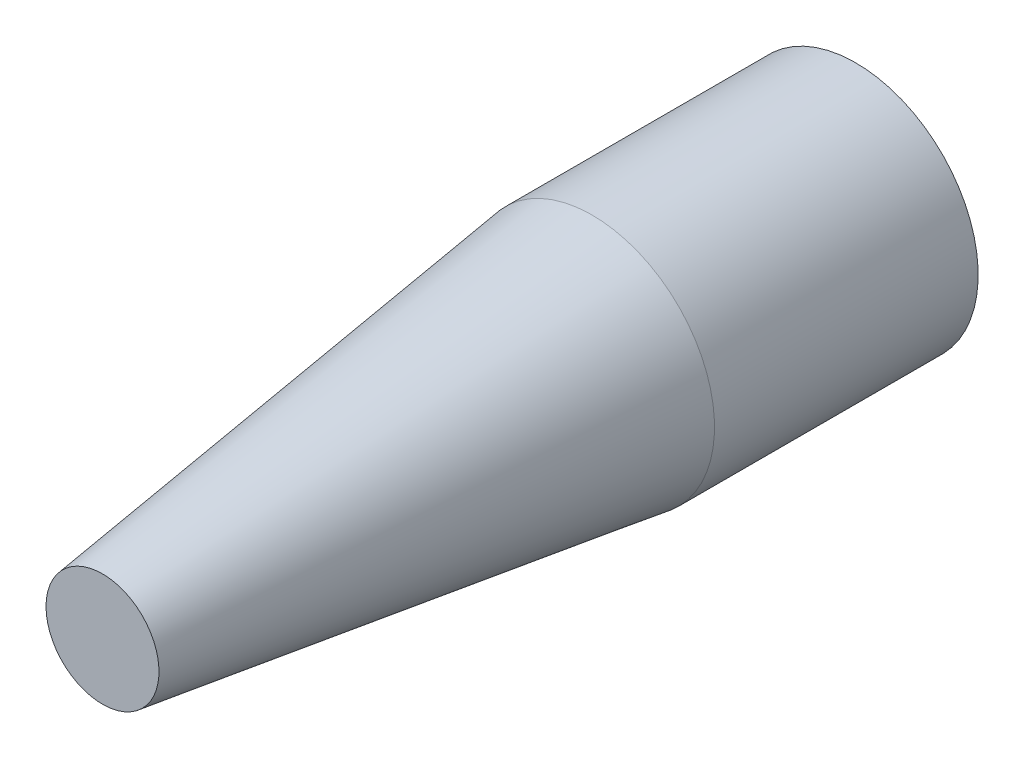
ISO-10303-21;
HEADER;
FILE_DESCRIPTION(('STEP AP214'),'2;1');
FILE_NAME('part.step','',(''),(''),'','','');
FILE_SCHEMA(('AUTOMOTIVE_DESIGN { 1 0 10303 214 1 1 1 1 }'));
ENDSEC;
DATA;
#1=APPLICATION_CONTEXT('core data for automotive mechanical design processes');
#2=APPLICATION_PROTOCOL_DEFINITION('international standard','automotive_design',2000,#1);
#3=PRODUCT_CONTEXT('',#1,'mechanical');
#4=PRODUCT('Part','Part','',(#3));
#5=PRODUCT_RELATED_PRODUCT_CATEGORY('part','',(#4));
#6=PRODUCT_DEFINITION_FORMATION('','',#4);
#7=PRODUCT_DEFINITION_CONTEXT('part definition',#1,'design');
#8=PRODUCT_DEFINITION('design','',#6,#7);
#9=PRODUCT_DEFINITION_SHAPE('','',#8);
#10=(LENGTH_UNIT() NAMED_UNIT(*) SI_UNIT(.MILLI.,.METRE.));
#11=(NAMED_UNIT(*) PLANE_ANGLE_UNIT() SI_UNIT($,.RADIAN.));
#12=(NAMED_UNIT(*) SI_UNIT($,.STERADIAN.) SOLID_ANGLE_UNIT());
#13=UNCERTAINTY_MEASURE_WITH_UNIT(LENGTH_MEASURE(1.E-05),#10,'distance_accuracy_value','');
#14=(GEOMETRIC_REPRESENTATION_CONTEXT(3) GLOBAL_UNCERTAINTY_ASSIGNED_CONTEXT((#13)) GLOBAL_UNIT_ASSIGNED_CONTEXT((#10,
#11,#12)) REPRESENTATION_CONTEXT('',''));
#15=CARTESIAN_POINT('',(0.,0.,0.));
#16=DIRECTION('',(0.,0.,1.));
#17=DIRECTION('',(1.,0.,0.));
#18=AXIS2_PLACEMENT_3D('',#15,#16,#17);
#19=CARTESIAN_POINT('',(0.,0.,7.));
#20=DIRECTION('',(0.,0.,-1.));
#21=DIRECTION('',(-1.,0.,0.));
#22=AXIS2_PLACEMENT_3D('',#19,#20,#21);
#23=CONICAL_SURFACE('',#22,3.25,0.133810977474591);
#24=CARTESIAN_POINT('',(0.,0.,20.));
#25=DIRECTION('',(0.,0.,-1.));
#26=DIRECTION('',(-1.,0.,0.));
#27=AXIS2_PLACEMENT_3D('',#24,#25,#26);
#28=CIRCLE('',#27,1.5);
#29=CARTESIAN_POINT('',(-1.5,0.,20.));
#30=VERTEX_POINT('',#29);
#31=EDGE_CURVE('E11',#30,#30,#28,.T.);
#32=ORIENTED_EDGE('',*,*,#31,.T.);
#33=EDGE_LOOP('',(#32));
#34=FACE_BOUND('',#33,.T.);
#35=CARTESIAN_POINT('',(0.,0.,7.));
#36=DIRECTION('',(0.,0.,-1.));
#37=DIRECTION('',(-1.,0.,0.));
#38=AXIS2_PLACEMENT_3D('',#35,#36,#37);
#39=CIRCLE('',#38,3.25);
#40=CARTESIAN_POINT('',(-3.25,0.,7.));
#41=VERTEX_POINT('',#40);
#42=EDGE_CURVE('E67',#41,#41,#39,.T.);
#43=ORIENTED_EDGE('',*,*,#42,.F.);
#44=EDGE_LOOP('',(#43));
#45=FACE_BOUND('',#44,.T.);
#46=ADVANCED_FACE('F35',(#34,#45),#23,.T.);
#47=CARTESIAN_POINT('',(-1.5,0.,20.));
#48=DIRECTION('',(0.,0.,1.));
#49=DIRECTION('',(1.,0.,0.));
#50=AXIS2_PLACEMENT_3D('',#47,#48,#49);
#51=PLANE('',#50);
#52=ORIENTED_EDGE('',*,*,#31,.F.);
#53=EDGE_LOOP('',(#52));
#54=FACE_BOUND('',#53,.T.);
#55=ADVANCED_FACE('F47',(#54),#51,.T.);
#56=CARTESIAN_POINT('',(0.,0.,11.2167603807643));
#57=DIRECTION('',(0.,0.,-1.));
#58=DIRECTION('',(-1.,0.,0.));
#59=AXIS2_PLACEMENT_3D('',#56,#57,#58);
#60=CONICAL_SURFACE('',#59,0.,0.436332312998583);
#61=CARTESIAN_POINT('',(0.,0.,8.));
#62=DIRECTION('',(0.,0.,-1.));
#63=DIRECTION('',(-1.,0.,0.));
#64=AXIS2_PLACEMENT_3D('',#61,#62,#63);
#65=CIRCLE('',#64,1.5);
#66=CARTESIAN_POINT('',(-1.5,0.,8.));
#67=VERTEX_POINT('',#66);
#68=EDGE_CURVE('E41',#67,#67,#65,.T.);
#69=ORIENTED_EDGE('',*,*,#68,.T.);
#70=EDGE_LOOP('',(#69));
#71=FACE_BOUND('',#70,.T.);
#72=CARTESIAN_POINT('',(0.,0.,11.2167603807643));
#73=VERTEX_POINT('',#72);
#74=VERTEX_LOOP('',#73);
#75=FACE_BOUND('',#74,.T.);
#76=ADVANCED_FACE('F44',(#71,#75),#60,.F.);
#77=CARTESIAN_POINT('',(0.,0.,0.));
#78=DIRECTION('',(0.,0.,-1.));
#79=DIRECTION('',(-1.,0.,0.));
#80=AXIS2_PLACEMENT_3D('',#77,#78,#79);
#81=CYLINDRICAL_SURFACE('',#80,1.5);
#82=CARTESIAN_POINT('',(0.,0.,0.));
#83=DIRECTION('',(0.,0.,-1.));
#84=DIRECTION('',(-1.,0.,0.));
#85=AXIS2_PLACEMENT_3D('',#82,#83,#84);
#86=CIRCLE('',#85,1.5);
#87=CARTESIAN_POINT('',(-1.5,0.,0.));
#88=VERTEX_POINT('',#87);
#89=EDGE_CURVE('E72',#88,#88,#86,.T.);
#90=ORIENTED_EDGE('',*,*,#89,.T.);
#91=EDGE_LOOP('',(#90));
#92=FACE_BOUND('',#91,.T.);
#93=ORIENTED_EDGE('',*,*,#68,.F.);
#94=EDGE_LOOP('',(#93));
#95=FACE_BOUND('',#94,.T.);
#96=ADVANCED_FACE('F46',(#92,#95),#81,.F.);
#97=CARTESIAN_POINT('',(-1.5,0.,0.));
#98=DIRECTION('',(0.,0.,-1.));
#99=DIRECTION('',(-1.,0.,0.));
#100=AXIS2_PLACEMENT_3D('',#97,#98,#99);
#101=PLANE('',#100);
#102=CARTESIAN_POINT('',(0.,0.,0.));
#103=DIRECTION('',(0.,0.,-1.));
#104=DIRECTION('',(-1.,0.,0.));
#105=AXIS2_PLACEMENT_3D('',#102,#103,#104);
#106=CIRCLE('',#105,3.25);
#107=CARTESIAN_POINT('',(-3.25,0.,0.));
#108=VERTEX_POINT('',#107);
#109=EDGE_CURVE('E69',#108,#108,#106,.T.);
#110=ORIENTED_EDGE('',*,*,#109,.T.);
#111=EDGE_LOOP('',(#110));
#112=FACE_BOUND('',#111,.T.);
#113=ORIENTED_EDGE('',*,*,#89,.F.);
#114=EDGE_LOOP('',(#113));
#115=FACE_BOUND('',#114,.T.);
#116=ADVANCED_FACE('F54',(#112,#115),#101,.T.);
#117=CARTESIAN_POINT('',(0.,0.,0.));
#118=DIRECTION('',(0.,0.,-1.));
#119=DIRECTION('',(-1.,0.,0.));
#120=AXIS2_PLACEMENT_3D('',#117,#118,#119);
#121=CYLINDRICAL_SURFACE('',#120,3.25);
#122=ORIENTED_EDGE('',*,*,#42,.T.);
#123=EDGE_LOOP('',(#122));
#124=FACE_BOUND('',#123,.T.);
#125=ORIENTED_EDGE('',*,*,#109,.F.);
#126=EDGE_LOOP('',(#125));
#127=FACE_BOUND('',#126,.T.);
#128=ADVANCED_FACE('F81',(#124,#127),#121,.T.);
#129=CLOSED_SHELL('',(#46,#55,#76,#96,#116,#128));
#130=MANIFOLD_SOLID_BREP('B2',#129);
#131=ADVANCED_BREP_SHAPE_REPRESENTATION('',(#18,#130),#14);
#132=SHAPE_DEFINITION_REPRESENTATION(#9,#131);
ENDSEC;
END-ISO-10303-21;
